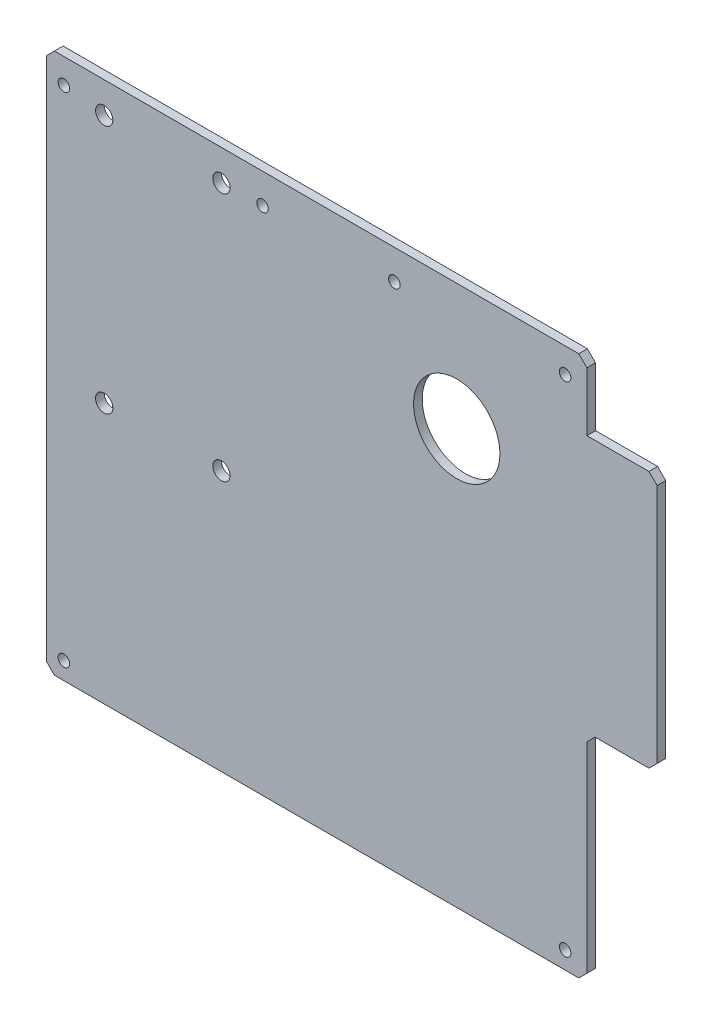
ISO-10303-21;
HEADER;
FILE_DESCRIPTION(('STEP AP214'),'2;1');
FILE_NAME('part.step','',(''),(''),'','','');
FILE_SCHEMA(('AUTOMOTIVE_DESIGN { 1 0 10303 214 1 1 1 1 }'));
ENDSEC;
DATA;
#1=APPLICATION_CONTEXT('core data for automotive mechanical design processes');
#2=APPLICATION_PROTOCOL_DEFINITION('international standard','automotive_design',2000,#1);
#3=PRODUCT_CONTEXT('',#1,'mechanical');
#4=PRODUCT('Part','Part','',(#3));
#5=PRODUCT_RELATED_PRODUCT_CATEGORY('part','',(#4));
#6=PRODUCT_DEFINITION_FORMATION('','',#4);
#7=PRODUCT_DEFINITION_CONTEXT('part definition',#1,'design');
#8=PRODUCT_DEFINITION('design','',#6,#7);
#9=PRODUCT_DEFINITION_SHAPE('','',#8);
#10=(LENGTH_UNIT() NAMED_UNIT(*) SI_UNIT(.MILLI.,.METRE.));
#11=(NAMED_UNIT(*) PLANE_ANGLE_UNIT() SI_UNIT($,.RADIAN.));
#12=(NAMED_UNIT(*) SI_UNIT($,.STERADIAN.) SOLID_ANGLE_UNIT());
#13=UNCERTAINTY_MEASURE_WITH_UNIT(LENGTH_MEASURE(1.E-05),#10,'distance_accuracy_value','');
#14=(GEOMETRIC_REPRESENTATION_CONTEXT(3) GLOBAL_UNCERTAINTY_ASSIGNED_CONTEXT((#13)) GLOBAL_UNIT_ASSIGNED_CONTEXT((#10,
#11,#12)) REPRESENTATION_CONTEXT('',''));
#15=CARTESIAN_POINT('',(0.,0.,0.));
#16=DIRECTION('',(0.,0.,1.));
#17=DIRECTION('',(1.,0.,0.));
#18=AXIS2_PLACEMENT_3D('',#15,#16,#17);
#19=CARTESIAN_POINT('',(0.,0.,1.5));
#20=DIRECTION('',(0.,0.,1.));
#21=DIRECTION('',(1.,0.,0.));
#22=AXIS2_PLACEMENT_3D('',#19,#20,#21);
#23=PLANE('',#22);
#24=CARTESIAN_POINT('',(0.,-86.5552223209638,1.5));
#25=DIRECTION('',(0.,0.,1.));
#26=DIRECTION('',(1.,0.,0.));
#27=AXIS2_PLACEMENT_3D('',#24,#25,#26);
#28=CIRCLE('',#27,0.999999999999841);
#29=CARTESIAN_POINT('',(0.999999999999841,-86.5552223209638,1.5));
#30=VERTEX_POINT('',#29);
#31=EDGE_CURVE('E408',#30,#30,#28,.T.);
#32=ORIENTED_EDGE('',*,*,#31,.F.);
#33=EDGE_LOOP('',(#32));
#34=FACE_BOUND('',#33,.T.);
#35=CARTESIAN_POINT('',(7.00290071787513,-44.3172471332476,1.5));
#36=DIRECTION('',(0.,0.,1.));
#37=DIRECTION('',(1.,0.,0.));
#38=AXIS2_PLACEMENT_3D('',#35,#36,#37);
#39=CIRCLE('',#38,1.50000000000008);
#40=CARTESIAN_POINT('',(8.5029007178752,-44.3172471332476,1.5));
#41=VERTEX_POINT('',#40);
#42=EDGE_CURVE('E424',#41,#41,#39,.T.);
#43=ORIENTED_EDGE('',*,*,#42,.F.);
#44=EDGE_LOOP('',(#43));
#45=FACE_BOUND('',#44,.T.);
#46=CARTESIAN_POINT('',(87.0793798299068,0.00310699714733964,1.5));
#47=DIRECTION('',(0.,0.,1.));
#48=DIRECTION('',(1.,0.,0.));
#49=AXIS2_PLACEMENT_3D('',#46,#47,#48);
#50=CIRCLE('',#49,0.999999999999838);
#51=CARTESIAN_POINT('',(88.0793798299066,0.00310699714733964,1.5));
#52=VERTEX_POINT('',#51);
#53=EDGE_CURVE('E440',#52,#52,#50,.T.);
#54=ORIENTED_EDGE('',*,*,#53,.F.);
#55=EDGE_LOOP('',(#54));
#56=FACE_BOUND('',#55,.T.);
#57=CARTESIAN_POINT('',(34.5090412402937,-0.868109842539377,1.5));
#58=DIRECTION('',(0.,0.,1.));
#59=DIRECTION('',(1.,0.,0.));
#60=AXIS2_PLACEMENT_3D('',#57,#58,#59);
#61=CIRCLE('',#60,0.999999999999998);
#62=CARTESIAN_POINT('',(35.5090412402937,-0.868109842539377,1.5));
#63=VERTEX_POINT('',#62);
#64=EDGE_CURVE('E456',#63,#63,#61,.T.);
#65=ORIENTED_EDGE('',*,*,#64,.F.);
#66=EDGE_LOOP('',(#65));
#67=FACE_BOUND('',#66,.T.);
#68=CARTESIAN_POINT('',(7.00290071787513,-1.01847825858581,1.5));
#69=DIRECTION('',(0.,0.,1.));
#70=DIRECTION('',(1.,0.,0.));
#71=AXIS2_PLACEMENT_3D('',#68,#69,#70);
#72=CIRCLE('',#71,1.50000000000008);
#73=CARTESIAN_POINT('',(8.5029007178752,-1.01847825858581,1.5));
#74=VERTEX_POINT('',#73);
#75=EDGE_CURVE('E472',#74,#74,#72,.T.);
#76=ORIENTED_EDGE('',*,*,#75,.F.);
#77=EDGE_LOOP('',(#76));
#78=FACE_BOUND('',#77,.T.);
#79=DIRECTION('',(-0.707106781186546,0.707106781186549,0.));
#80=VECTOR('',#79,1.);
#81=CARTESIAN_POINT('',(90.867322078492,2.92282946996818,1.5));
#82=LINE('',#81,#80);
#83=CARTESIAN_POINT('',(90.867322078492,2.92282946996818,1.5));
#84=VERTEX_POINT('',#83);
#85=CARTESIAN_POINT('',(89.4531085161189,4.33704303234128,1.5));
#86=VERTEX_POINT('',#85);
#87=EDGE_CURVE('E227',#84,#86,#82,.T.);
#88=ORIENTED_EDGE('',*,*,#87,.T.);
#89=DIRECTION('',(-1.,0.,0.));
#90=VECTOR('',#89,1.);
#91=CARTESIAN_POINT('',(89.4531085161189,4.33704303234128,1.5));
#92=LINE('',#91,#90);
#93=CARTESIAN_POINT('',(-1.64322979611291,4.33704303234127,1.5));
#94=VERTEX_POINT('',#93);
#95=EDGE_CURVE('E121',#86,#94,#92,.T.);
#96=ORIENTED_EDGE('',*,*,#95,.T.);
#97=DIRECTION('',(-0.707106781186546,-0.707106781186549,0.));
#98=VECTOR('',#97,1.);
#99=CARTESIAN_POINT('',(-1.64322979611291,4.33704303234127,1.5));
#100=LINE('',#99,#98);
#101=CARTESIAN_POINT('',(-3.057443358486,2.92282946996818,1.5));
#102=VERTEX_POINT('',#101);
#103=EDGE_CURVE('E276',#94,#102,#100,.T.);
#104=ORIENTED_EDGE('',*,*,#103,.T.);
#105=DIRECTION('',(0.,-1.,0.));
#106=VECTOR('',#105,1.);
#107=CARTESIAN_POINT('',(-3.057443358486,2.92282946996818,1.5));
#108=LINE('',#107,#106);
#109=CARTESIAN_POINT('',(-3.05744335848598,-88.1735088422632,1.5));
#110=VERTEX_POINT('',#109);
#111=EDGE_CURVE('E296',#102,#110,#108,.T.);
#112=ORIENTED_EDGE('',*,*,#111,.T.);
#113=DIRECTION('',(0.707106781186546,-0.707106781186549,0.));
#114=VECTOR('',#113,1.);
#115=CARTESIAN_POINT('',(-3.05744335848598,-88.1735088422632,1.5));
#116=LINE('',#115,#114);
#117=CARTESIAN_POINT('',(-1.64322979611289,-89.5877224046363,1.5));
#118=VERTEX_POINT('',#117);
#119=EDGE_CURVE('E292',#110,#118,#116,.T.);
#120=ORIENTED_EDGE('',*,*,#119,.T.);
#121=DIRECTION('',(1.,0.,0.));
#122=VECTOR('',#121,1.);
#123=CARTESIAN_POINT('',(-1.64322979611289,-89.5877224046363,1.5));
#124=LINE('',#123,#122);
#125=CARTESIAN_POINT('',(89.4531085161188,-89.5877224046363,1.5));
#126=VERTEX_POINT('',#125);
#127=EDGE_CURVE('E295',#118,#126,#124,.T.);
#128=ORIENTED_EDGE('',*,*,#127,.T.);
#129=DIRECTION('',(0.707106781186547,0.707106781186547,0.));
#130=VECTOR('',#129,1.);
#131=CARTESIAN_POINT('',(89.4531085161188,-89.5877224046363,1.5));
#132=LINE('',#131,#130);
#133=CARTESIAN_POINT('',(90.8673220784919,-88.1735088422632,1.5));
#134=VERTEX_POINT('',#133);
#135=EDGE_CURVE('E300',#126,#134,#132,.T.);
#136=ORIENTED_EDGE('',*,*,#135,.T.);
#137=DIRECTION('',(0.,1.,0.));
#138=VECTOR('',#137,1.);
#139=CARTESIAN_POINT('',(90.8673220784919,-88.1735088422632,1.5));
#140=LINE('',#139,#138);
#141=CARTESIAN_POINT('',(90.8673220784919,-53.3416574959021,1.5));
#142=VERTEX_POINT('',#141);
#143=EDGE_CURVE('E307',#134,#142,#140,.T.);
#144=ORIENTED_EDGE('',*,*,#143,.T.);
#145=DIRECTION('',(0.707106781186549,0.707106781186546,0.));
#146=VECTOR('',#145,1.);
#147=CARTESIAN_POINT('',(90.8673220784919,-53.3416574959021,1.5));
#148=LINE('',#147,#146);
#149=CARTESIAN_POINT('',(92.281535640865,-51.927443933529,1.5));
#150=VERTEX_POINT('',#149);
#151=EDGE_CURVE('E310',#142,#150,#148,.T.);
#152=ORIENTED_EDGE('',*,*,#151,.T.);
#153=DIRECTION('',(1.,0.,0.));
#154=VECTOR('',#153,1.);
#155=CARTESIAN_POINT('',(92.281535640865,-51.927443933529,1.5));
#156=LINE('',#155,#154);
#157=CARTESIAN_POINT('',(101.643338185774,-51.927443933529,1.5));
#158=VERTEX_POINT('',#157);
#159=EDGE_CURVE('E313',#150,#158,#156,.T.);
#160=ORIENTED_EDGE('',*,*,#159,.T.);
#161=DIRECTION('',(0.707106781186547,0.707106781186547,0.));
#162=VECTOR('',#161,1.);
#163=CARTESIAN_POINT('',(101.643338185774,-51.927443933529,1.5));
#164=LINE('',#163,#162);
#165=CARTESIAN_POINT('',(103.057551748147,-50.5132303711559,1.5));
#166=VERTEX_POINT('',#165);
#167=EDGE_CURVE('E316',#158,#166,#164,.T.);
#168=ORIENTED_EDGE('',*,*,#167,.T.);
#169=DIRECTION('',(0.,1.,0.));
#170=VECTOR('',#169,1.);
#171=CARTESIAN_POINT('',(103.057551748147,-50.5132303711559,1.5));
#172=LINE('',#171,#170);
#173=CARTESIAN_POINT('',(103.057551748147,-8.69292339895869,1.5));
#174=VERTEX_POINT('',#173);
#175=EDGE_CURVE('E161',#166,#174,#172,.T.);
#176=ORIENTED_EDGE('',*,*,#175,.T.);
#177=DIRECTION('',(-0.707106781186554,0.707106781186541,0.));
#178=VECTOR('',#177,1.);
#179=CARTESIAN_POINT('',(103.057551748147,-8.69292339895869,1.5));
#180=LINE('',#179,#178);
#181=CARTESIAN_POINT('',(101.643338185774,-7.27870983658562,1.5));
#182=VERTEX_POINT('',#181);
#183=EDGE_CURVE('E155',#174,#182,#180,.T.);
#184=ORIENTED_EDGE('',*,*,#183,.T.);
#185=DIRECTION('',(-1.,0.,0.));
#186=VECTOR('',#185,1.);
#187=CARTESIAN_POINT('',(101.643338185774,-7.27870983658562,1.5));
#188=LINE('',#187,#186);
#189=CARTESIAN_POINT('',(90.8673220784919,-7.27870983658563,1.5));
#190=VERTEX_POINT('',#189);
#191=EDGE_CURVE('E159',#182,#190,#188,.T.);
#192=ORIENTED_EDGE('',*,*,#191,.T.);
#193=DIRECTION('',(0.,1.,0.));
#194=VECTOR('',#193,1.);
#195=CARTESIAN_POINT('',(90.8673220784919,-7.27870983658563,1.5));
#196=LINE('',#195,#194);
#197=EDGE_CURVE('E57',#190,#84,#196,.T.);
#198=ORIENTED_EDGE('',*,*,#197,.T.);
#199=EDGE_LOOP('',(#88,#96,#104,#112,#120,#128,#136,#144,#152,#160,#168,#176,#184,#192,#198));
#200=FACE_BOUND('',#199,.T.);
#201=CARTESIAN_POINT('',(0.,0.,1.5));
#202=DIRECTION('',(0.,0.,1.));
#203=DIRECTION('',(1.,0.,0.));
#204=AXIS2_PLACEMENT_3D('',#201,#202,#203);
#205=CIRCLE('',#204,0.999999999999839);
#206=CARTESIAN_POINT('',(0.999999999999839,0.,1.5));
#207=VERTEX_POINT('',#206);
#208=EDGE_CURVE('E188',#207,#207,#205,.T.);
#209=ORIENTED_EDGE('',*,*,#208,.F.);
#210=EDGE_LOOP('',(#209));
#211=FACE_BOUND('',#210,.T.);
#212=CARTESIAN_POINT('',(27.3718188735983,-1.01847825858581,1.5));
#213=DIRECTION('',(0.,0.,1.));
#214=DIRECTION('',(1.,0.,0.));
#215=AXIS2_PLACEMENT_3D('',#212,#213,#214);
#216=CIRCLE('',#215,1.50000000000008);
#217=CARTESIAN_POINT('',(28.8718188735984,-1.01847825858581,1.5));
#218=VERTEX_POINT('',#217);
#219=EDGE_CURVE('E464',#218,#218,#216,.T.);
#220=ORIENTED_EDGE('',*,*,#219,.F.);
#221=EDGE_LOOP('',(#220));
#222=FACE_BOUND('',#221,.T.);
#223=CARTESIAN_POINT('',(57.4135256428072,-0.868109842539377,1.5));
#224=DIRECTION('',(0.,0.,1.));
#225=DIRECTION('',(1.,0.,0.));
#226=AXIS2_PLACEMENT_3D('',#223,#224,#225);
#227=CIRCLE('',#226,0.999999999999998);
#228=CARTESIAN_POINT('',(58.4135256428072,-0.868109842539377,1.5));
#229=VERTEX_POINT('',#228);
#230=EDGE_CURVE('E448',#229,#229,#227,.T.);
#231=ORIENTED_EDGE('',*,*,#230,.F.);
#232=EDGE_LOOP('',(#231));
#233=FACE_BOUND('',#232,.T.);
#234=CARTESIAN_POINT('',(68.2506951721249,-17.5588520296848,1.5));
#235=DIRECTION('',(0.,0.,1.));
#236=DIRECTION('',(1.,0.,0.));
#237=AXIS2_PLACEMENT_3D('',#234,#235,#236);
#238=CIRCLE('',#237,7.50249488085252);
#239=CARTESIAN_POINT('',(75.7531900529774,-17.5588520296848,1.5));
#240=VERTEX_POINT('',#239);
#241=EDGE_CURVE('E432',#240,#240,#238,.T.);
#242=ORIENTED_EDGE('',*,*,#241,.F.);
#243=EDGE_LOOP('',(#242));
#244=FACE_BOUND('',#243,.T.);
#245=CARTESIAN_POINT('',(27.3718188735983,-44.3172471332476,1.5));
#246=DIRECTION('',(0.,0.,1.));
#247=DIRECTION('',(1.,0.,0.));
#248=AXIS2_PLACEMENT_3D('',#245,#246,#247);
#249=CIRCLE('',#248,1.50000000000008);
#250=CARTESIAN_POINT('',(28.8718188735984,-44.3172471332476,1.5));
#251=VERTEX_POINT('',#250);
#252=EDGE_CURVE('E416',#251,#251,#249,.T.);
#253=ORIENTED_EDGE('',*,*,#252,.F.);
#254=EDGE_LOOP('',(#253));
#255=FACE_BOUND('',#254,.T.);
#256=CARTESIAN_POINT('',(87.0793798299068,-86.5552223209638,1.5));
#257=DIRECTION('',(0.,0.,1.));
#258=DIRECTION('',(1.,0.,0.));
#259=AXIS2_PLACEMENT_3D('',#256,#257,#258);
#260=CIRCLE('',#259,0.999999999999836);
#261=CARTESIAN_POINT('',(88.0793798299066,-86.5552223209638,1.5));
#262=VERTEX_POINT('',#261);
#263=EDGE_CURVE('E397',#262,#262,#260,.T.);
#264=ORIENTED_EDGE('',*,*,#263,.F.);
#265=EDGE_LOOP('',(#264));
#266=FACE_BOUND('',#265,.T.);
#267=ADVANCED_FACE('F39',(#34,#45,#56,#67,#78,#200,#211,#222,#233,#244,#255,#266),#23,.T.);
#268=CARTESIAN_POINT('',(0.,0.,0.));
#269=DIRECTION('',(0.,0.,1.));
#270=DIRECTION('',(1.,0.,0.));
#271=AXIS2_PLACEMENT_3D('',#268,#269,#270);
#272=PLANE('',#271);
#273=DIRECTION('',(-0.707106781186546,0.707106781186549,0.));
#274=VECTOR('',#273,1.);
#275=CARTESIAN_POINT('',(90.867322078492,2.92282946996818,0.));
#276=LINE('',#275,#274);
#277=CARTESIAN_POINT('',(90.867322078492,2.92282946996818,0.));
#278=VERTEX_POINT('',#277);
#279=CARTESIAN_POINT('',(89.4531085161189,4.33704303234128,0.));
#280=VERTEX_POINT('',#279);
#281=EDGE_CURVE('E183',#278,#280,#276,.T.);
#282=ORIENTED_EDGE('',*,*,#281,.F.);
#283=DIRECTION('',(0.,1.,0.));
#284=VECTOR('',#283,1.);
#285=CARTESIAN_POINT('',(90.8673220784919,-7.27870983658563,0.));
#286=LINE('',#285,#284);
#287=CARTESIAN_POINT('',(90.8673220784919,-7.27870983658563,0.));
#288=VERTEX_POINT('',#287);
#289=EDGE_CURVE('E113',#288,#278,#286,.T.);
#290=ORIENTED_EDGE('',*,*,#289,.F.);
#291=DIRECTION('',(-1.,0.,0.));
#292=VECTOR('',#291,1.);
#293=CARTESIAN_POINT('',(101.643338185774,-7.27870983658562,0.));
#294=LINE('',#293,#292);
#295=CARTESIAN_POINT('',(101.643338185774,-7.27870983658562,0.));
#296=VERTEX_POINT('',#295);
#297=EDGE_CURVE('E107',#296,#288,#294,.T.);
#298=ORIENTED_EDGE('',*,*,#297,.F.);
#299=DIRECTION('',(-0.707106781186554,0.707106781186541,0.));
#300=VECTOR('',#299,1.);
#301=CARTESIAN_POINT('',(103.057551748147,-8.69292339895869,0.));
#302=LINE('',#301,#300);
#303=CARTESIAN_POINT('',(103.057551748147,-8.69292339895869,0.));
#304=VERTEX_POINT('',#303);
#305=EDGE_CURVE('E170',#304,#296,#302,.T.);
#306=ORIENTED_EDGE('',*,*,#305,.F.);
#307=DIRECTION('',(0.,1.,0.));
#308=VECTOR('',#307,1.);
#309=CARTESIAN_POINT('',(103.057551748147,-50.5132303711559,0.));
#310=LINE('',#309,#308);
#311=CARTESIAN_POINT('',(103.057551748147,-50.5132303711559,0.));
#312=VERTEX_POINT('',#311);
#313=EDGE_CURVE('E218',#312,#304,#310,.T.);
#314=ORIENTED_EDGE('',*,*,#313,.F.);
#315=DIRECTION('',(0.707106781186547,0.707106781186547,0.));
#316=VECTOR('',#315,1.);
#317=CARTESIAN_POINT('',(101.643338185774,-51.927443933529,0.));
#318=LINE('',#317,#316);
#319=CARTESIAN_POINT('',(101.643338185774,-51.927443933529,0.));
#320=VERTEX_POINT('',#319);
#321=EDGE_CURVE('E215',#320,#312,#318,.T.);
#322=ORIENTED_EDGE('',*,*,#321,.F.);
#323=DIRECTION('',(1.,0.,0.));
#324=VECTOR('',#323,1.);
#325=CARTESIAN_POINT('',(92.281535640865,-51.927443933529,0.));
#326=LINE('',#325,#324);
#327=CARTESIAN_POINT('',(92.281535640865,-51.927443933529,0.));
#328=VERTEX_POINT('',#327);
#329=EDGE_CURVE('E212',#328,#320,#326,.T.);
#330=ORIENTED_EDGE('',*,*,#329,.F.);
#331=DIRECTION('',(0.707106781186549,0.707106781186546,0.));
#332=VECTOR('',#331,1.);
#333=CARTESIAN_POINT('',(90.8673220784919,-53.3416574959021,0.));
#334=LINE('',#333,#332);
#335=CARTESIAN_POINT('',(90.8673220784919,-53.3416574959021,0.));
#336=VERTEX_POINT('',#335);
#337=EDGE_CURVE('E209',#336,#328,#334,.T.);
#338=ORIENTED_EDGE('',*,*,#337,.F.);
#339=DIRECTION('',(0.,1.,0.));
#340=VECTOR('',#339,1.);
#341=CARTESIAN_POINT('',(90.8673220784919,-88.1735088422632,0.));
#342=LINE('',#341,#340);
#343=CARTESIAN_POINT('',(90.8673220784919,-88.1735088422632,0.));
#344=VERTEX_POINT('',#343);
#345=EDGE_CURVE('E206',#344,#336,#342,.T.);
#346=ORIENTED_EDGE('',*,*,#345,.F.);
#347=DIRECTION('',(0.707106781186547,0.707106781186547,0.));
#348=VECTOR('',#347,1.);
#349=CARTESIAN_POINT('',(89.4531085161188,-89.5877224046363,0.));
#350=LINE('',#349,#348);
#351=CARTESIAN_POINT('',(89.4531085161188,-89.5877224046363,0.));
#352=VERTEX_POINT('',#351);
#353=EDGE_CURVE('E203',#352,#344,#350,.T.);
#354=ORIENTED_EDGE('',*,*,#353,.F.);
#355=DIRECTION('',(1.,0.,0.));
#356=VECTOR('',#355,1.);
#357=CARTESIAN_POINT('',(-1.64322979611289,-89.5877224046363,0.));
#358=LINE('',#357,#356);
#359=CARTESIAN_POINT('',(-1.64322979611289,-89.5877224046363,0.));
#360=VERTEX_POINT('',#359);
#361=EDGE_CURVE('E200',#360,#352,#358,.T.);
#362=ORIENTED_EDGE('',*,*,#361,.F.);
#363=DIRECTION('',(0.707106781186546,-0.707106781186549,0.));
#364=VECTOR('',#363,1.);
#365=CARTESIAN_POINT('',(-3.05744335848598,-88.1735088422632,0.));
#366=LINE('',#365,#364);
#367=CARTESIAN_POINT('',(-3.05744335848598,-88.1735088422632,0.));
#368=VERTEX_POINT('',#367);
#369=EDGE_CURVE('E197',#368,#360,#366,.T.);
#370=ORIENTED_EDGE('',*,*,#369,.F.);
#371=DIRECTION('',(0.,-1.,0.));
#372=VECTOR('',#371,1.);
#373=CARTESIAN_POINT('',(-3.057443358486,2.92282946996818,0.));
#374=LINE('',#373,#372);
#375=CARTESIAN_POINT('',(-3.057443358486,2.92282946996818,0.));
#376=VERTEX_POINT('',#375);
#377=EDGE_CURVE('E194',#376,#368,#374,.T.);
#378=ORIENTED_EDGE('',*,*,#377,.F.);
#379=DIRECTION('',(-0.707106781186546,-0.707106781186549,0.));
#380=VECTOR('',#379,1.);
#381=CARTESIAN_POINT('',(-1.64322979611291,4.33704303234127,0.));
#382=LINE('',#381,#380);
#383=CARTESIAN_POINT('',(-1.64322979611291,4.33704303234127,0.));
#384=VERTEX_POINT('',#383);
#385=EDGE_CURVE('E191',#384,#376,#382,.T.);
#386=ORIENTED_EDGE('',*,*,#385,.F.);
#387=DIRECTION('',(-1.,0.,0.));
#388=VECTOR('',#387,1.);
#389=CARTESIAN_POINT('',(89.4531085161189,4.33704303234128,0.));
#390=LINE('',#389,#388);
#391=EDGE_CURVE('E187',#280,#384,#390,.T.);
#392=ORIENTED_EDGE('',*,*,#391,.F.);
#393=EDGE_LOOP('',(#282,#290,#298,#306,#314,#322,#330,#338,#346,#354,#362,#370,#378,#386,#392));
#394=FACE_BOUND('',#393,.T.);
#395=CARTESIAN_POINT('',(0.,0.,0.));
#396=DIRECTION('',(0.,0.,1.));
#397=DIRECTION('',(1.,0.,0.));
#398=AXIS2_PLACEMENT_3D('',#395,#396,#397);
#399=CIRCLE('',#398,0.999999999999839);
#400=CARTESIAN_POINT('',(0.999999999999839,0.,0.));
#401=VERTEX_POINT('',#400);
#402=EDGE_CURVE('E476',#401,#401,#399,.T.);
#403=ORIENTED_EDGE('',*,*,#402,.T.);
#404=EDGE_LOOP('',(#403));
#405=FACE_BOUND('',#404,.T.);
#406=CARTESIAN_POINT('',(7.00290071787513,-1.01847825858581,0.));
#407=DIRECTION('',(0.,0.,1.));
#408=DIRECTION('',(1.,0.,0.));
#409=AXIS2_PLACEMENT_3D('',#406,#407,#408);
#410=CIRCLE('',#409,1.50000000000008);
#411=CARTESIAN_POINT('',(8.5029007178752,-1.01847825858581,0.));
#412=VERTEX_POINT('',#411);
#413=EDGE_CURVE('E468',#412,#412,#410,.T.);
#414=ORIENTED_EDGE('',*,*,#413,.T.);
#415=EDGE_LOOP('',(#414));
#416=FACE_BOUND('',#415,.T.);
#417=CARTESIAN_POINT('',(27.3718188735983,-1.01847825858581,0.));
#418=DIRECTION('',(0.,0.,1.));
#419=DIRECTION('',(1.,0.,0.));
#420=AXIS2_PLACEMENT_3D('',#417,#418,#419);
#421=CIRCLE('',#420,1.50000000000008);
#422=CARTESIAN_POINT('',(28.8718188735984,-1.01847825858581,0.));
#423=VERTEX_POINT('',#422);
#424=EDGE_CURVE('E460',#423,#423,#421,.T.);
#425=ORIENTED_EDGE('',*,*,#424,.T.);
#426=EDGE_LOOP('',(#425));
#427=FACE_BOUND('',#426,.T.);
#428=CARTESIAN_POINT('',(34.5090412402937,-0.868109842539377,0.));
#429=DIRECTION('',(0.,0.,1.));
#430=DIRECTION('',(1.,0.,0.));
#431=AXIS2_PLACEMENT_3D('',#428,#429,#430);
#432=CIRCLE('',#431,0.999999999999998);
#433=CARTESIAN_POINT('',(35.5090412402937,-0.868109842539377,0.));
#434=VERTEX_POINT('',#433);
#435=EDGE_CURVE('E452',#434,#434,#432,.T.);
#436=ORIENTED_EDGE('',*,*,#435,.T.);
#437=EDGE_LOOP('',(#436));
#438=FACE_BOUND('',#437,.T.);
#439=CARTESIAN_POINT('',(57.4135256428072,-0.868109842539377,0.));
#440=DIRECTION('',(0.,0.,1.));
#441=DIRECTION('',(1.,0.,0.));
#442=AXIS2_PLACEMENT_3D('',#439,#440,#441);
#443=CIRCLE('',#442,0.999999999999998);
#444=CARTESIAN_POINT('',(58.4135256428072,-0.868109842539377,0.));
#445=VERTEX_POINT('',#444);
#446=EDGE_CURVE('E444',#445,#445,#443,.T.);
#447=ORIENTED_EDGE('',*,*,#446,.T.);
#448=EDGE_LOOP('',(#447));
#449=FACE_BOUND('',#448,.T.);
#450=CARTESIAN_POINT('',(87.0793798299068,0.00310699714733964,0.));
#451=DIRECTION('',(0.,0.,1.));
#452=DIRECTION('',(1.,0.,0.));
#453=AXIS2_PLACEMENT_3D('',#450,#451,#452);
#454=CIRCLE('',#453,0.999999999999838);
#455=CARTESIAN_POINT('',(88.0793798299066,0.00310699714733964,0.));
#456=VERTEX_POINT('',#455);
#457=EDGE_CURVE('E436',#456,#456,#454,.T.);
#458=ORIENTED_EDGE('',*,*,#457,.T.);
#459=EDGE_LOOP('',(#458));
#460=FACE_BOUND('',#459,.T.);
#461=CARTESIAN_POINT('',(68.2506951721249,-17.5588520296848,0.));
#462=DIRECTION('',(0.,0.,1.));
#463=DIRECTION('',(1.,0.,0.));
#464=AXIS2_PLACEMENT_3D('',#461,#462,#463);
#465=CIRCLE('',#464,7.50249488085252);
#466=CARTESIAN_POINT('',(75.7531900529774,-17.5588520296848,0.));
#467=VERTEX_POINT('',#466);
#468=EDGE_CURVE('E428',#467,#467,#465,.T.);
#469=ORIENTED_EDGE('',*,*,#468,.T.);
#470=EDGE_LOOP('',(#469));
#471=FACE_BOUND('',#470,.T.);
#472=CARTESIAN_POINT('',(7.00290071787513,-44.3172471332476,0.));
#473=DIRECTION('',(0.,0.,1.));
#474=DIRECTION('',(1.,0.,0.));
#475=AXIS2_PLACEMENT_3D('',#472,#473,#474);
#476=CIRCLE('',#475,1.50000000000008);
#477=CARTESIAN_POINT('',(8.5029007178752,-44.3172471332476,0.));
#478=VERTEX_POINT('',#477);
#479=EDGE_CURVE('E420',#478,#478,#476,.T.);
#480=ORIENTED_EDGE('',*,*,#479,.T.);
#481=EDGE_LOOP('',(#480));
#482=FACE_BOUND('',#481,.T.);
#483=CARTESIAN_POINT('',(27.3718188735983,-44.3172471332476,0.));
#484=DIRECTION('',(0.,0.,1.));
#485=DIRECTION('',(1.,0.,0.));
#486=AXIS2_PLACEMENT_3D('',#483,#484,#485);
#487=CIRCLE('',#486,1.50000000000008);
#488=CARTESIAN_POINT('',(28.8718188735984,-44.3172471332476,0.));
#489=VERTEX_POINT('',#488);
#490=EDGE_CURVE('E412',#489,#489,#487,.T.);
#491=ORIENTED_EDGE('',*,*,#490,.T.);
#492=EDGE_LOOP('',(#491));
#493=FACE_BOUND('',#492,.T.);
#494=CARTESIAN_POINT('',(0.,-86.5552223209638,0.));
#495=DIRECTION('',(0.,0.,1.));
#496=DIRECTION('',(1.,0.,0.));
#497=AXIS2_PLACEMENT_3D('',#494,#495,#496);
#498=CIRCLE('',#497,0.999999999999841);
#499=CARTESIAN_POINT('',(0.999999999999841,-86.5552223209638,0.));
#500=VERTEX_POINT('',#499);
#501=EDGE_CURVE('E405',#500,#500,#498,.T.);
#502=ORIENTED_EDGE('',*,*,#501,.T.);
#503=EDGE_LOOP('',(#502));
#504=FACE_BOUND('',#503,.T.);
#505=CARTESIAN_POINT('',(87.0793798299068,-86.5552223209638,0.));
#506=DIRECTION('',(0.,0.,1.));
#507=DIRECTION('',(1.,0.,0.));
#508=AXIS2_PLACEMENT_3D('',#505,#506,#507);
#509=CIRCLE('',#508,0.999999999999836);
#510=CARTESIAN_POINT('',(88.0793798299066,-86.5552223209638,0.));
#511=VERTEX_POINT('',#510);
#512=EDGE_CURVE('E400',#511,#511,#509,.T.);
#513=ORIENTED_EDGE('',*,*,#512,.T.);
#514=EDGE_LOOP('',(#513));
#515=FACE_BOUND('',#514,.T.);
#516=ADVANCED_FACE('F280',(#394,#405,#416,#427,#438,#449,#460,#471,#482,#493,#504,#515),#272,.F.);
#517=CARTESIAN_POINT('',(90.867322078492,2.92282946996818,1.5));
#518=DIRECTION('',(-0.707106781186549,-0.707106781186546,0.));
#519=DIRECTION('',(0.707106781186546,-0.707106781186549,0.));
#520=AXIS2_PLACEMENT_3D('',#517,#518,#519);
#521=PLANE('',#520);
#522=ORIENTED_EDGE('',*,*,#281,.T.);
#523=DIRECTION('',(0.,0.,-1.));
#524=VECTOR('',#523,1.);
#525=CARTESIAN_POINT('',(89.4531085161189,4.33704303234128,1.5));
#526=LINE('',#525,#524);
#527=EDGE_CURVE('E11',#86,#280,#526,.T.);
#528=ORIENTED_EDGE('',*,*,#527,.F.);
#529=ORIENTED_EDGE('',*,*,#87,.F.);
#530=DIRECTION('',(0.,0.,-1.));
#531=VECTOR('',#530,1.);
#532=CARTESIAN_POINT('',(90.867322078492,2.92282946996818,1.5));
#533=LINE('',#532,#531);
#534=EDGE_CURVE('E179',#84,#278,#533,.T.);
#535=ORIENTED_EDGE('',*,*,#534,.T.);
#536=EDGE_LOOP('',(#522,#528,#529,#535));
#537=FACE_BOUND('',#536,.T.);
#538=ADVANCED_FACE('F41',(#537),#521,.F.);
#539=CARTESIAN_POINT('',(89.4531085161189,4.33704303234128,1.5));
#540=DIRECTION('',(0.,-1.,0.));
#541=DIRECTION('',(1.,0.,0.));
#542=AXIS2_PLACEMENT_3D('',#539,#540,#541);
#543=PLANE('',#542);
#544=ORIENTED_EDGE('',*,*,#391,.T.);
#545=DIRECTION('',(0.,0.,-1.));
#546=VECTOR('',#545,1.);
#547=CARTESIAN_POINT('',(-1.64322979611291,4.33704303234127,1.5));
#548=LINE('',#547,#546);
#549=EDGE_CURVE('E49',#94,#384,#548,.T.);
#550=ORIENTED_EDGE('',*,*,#549,.F.);
#551=ORIENTED_EDGE('',*,*,#95,.F.);
#552=ORIENTED_EDGE('',*,*,#527,.T.);
#553=EDGE_LOOP('',(#544,#550,#551,#552));
#554=FACE_BOUND('',#553,.T.);
#555=ADVANCED_FACE('F685',(#554),#543,.F.);
#556=CARTESIAN_POINT('',(-1.64322979611291,4.33704303234127,1.5));
#557=DIRECTION('',(0.707106781186549,-0.707106781186546,0.));
#558=DIRECTION('',(0.707106781186546,0.707106781186549,0.));
#559=AXIS2_PLACEMENT_3D('',#556,#557,#558);
#560=PLANE('',#559);
#561=ORIENTED_EDGE('',*,*,#385,.T.);
#562=DIRECTION('',(0.,0.,-1.));
#563=VECTOR('',#562,1.);
#564=CARTESIAN_POINT('',(-3.057443358486,2.92282946996818,1.5));
#565=LINE('',#564,#563);
#566=EDGE_CURVE('E266',#102,#376,#565,.T.);
#567=ORIENTED_EDGE('',*,*,#566,.F.);
#568=ORIENTED_EDGE('',*,*,#103,.F.);
#569=ORIENTED_EDGE('',*,*,#549,.T.);
#570=EDGE_LOOP('',(#561,#567,#568,#569));
#571=FACE_BOUND('',#570,.T.);
#572=ADVANCED_FACE('F274',(#571),#560,.F.);
#573=CARTESIAN_POINT('',(-3.057443358486,2.92282946996818,1.5));
#574=DIRECTION('',(1.,0.,0.));
#575=DIRECTION('',(0.,1.,0.));
#576=AXIS2_PLACEMENT_3D('',#573,#574,#575);
#577=PLANE('',#576);
#578=ORIENTED_EDGE('',*,*,#377,.T.);
#579=DIRECTION('',(0.,0.,-1.));
#580=VECTOR('',#579,1.);
#581=CARTESIAN_POINT('',(-3.05744335848598,-88.1735088422632,1.5));
#582=LINE('',#581,#580);
#583=EDGE_CURVE('E262',#110,#368,#582,.T.);
#584=ORIENTED_EDGE('',*,*,#583,.F.);
#585=ORIENTED_EDGE('',*,*,#111,.F.);
#586=ORIENTED_EDGE('',*,*,#566,.T.);
#587=EDGE_LOOP('',(#578,#584,#585,#586));
#588=FACE_BOUND('',#587,.T.);
#589=ADVANCED_FACE('F286',(#588),#577,.F.);
#590=CARTESIAN_POINT('',(-3.05744335848598,-88.1735088422632,1.5));
#591=DIRECTION('',(0.707106781186549,0.707106781186546,0.));
#592=DIRECTION('',(-0.707106781186546,0.707106781186549,0.));
#593=AXIS2_PLACEMENT_3D('',#590,#591,#592);
#594=PLANE('',#593);
#595=ORIENTED_EDGE('',*,*,#369,.T.);
#596=DIRECTION('',(0.,0.,-1.));
#597=VECTOR('',#596,1.);
#598=CARTESIAN_POINT('',(-1.64322979611289,-89.5877224046363,1.5));
#599=LINE('',#598,#597);
#600=EDGE_CURVE('E258',#118,#360,#599,.T.);
#601=ORIENTED_EDGE('',*,*,#600,.F.);
#602=ORIENTED_EDGE('',*,*,#119,.F.);
#603=ORIENTED_EDGE('',*,*,#583,.T.);
#604=EDGE_LOOP('',(#595,#601,#602,#603));
#605=FACE_BOUND('',#604,.T.);
#606=ADVANCED_FACE('F290',(#605),#594,.F.);
#607=CARTESIAN_POINT('',(-1.64322979611289,-89.5877224046363,1.5));
#608=DIRECTION('',(0.,1.,0.));
#609=DIRECTION('',(-1.,0.,0.));
#610=AXIS2_PLACEMENT_3D('',#607,#608,#609);
#611=PLANE('',#610);
#612=ORIENTED_EDGE('',*,*,#361,.T.);
#613=DIRECTION('',(0.,0.,-1.));
#614=VECTOR('',#613,1.);
#615=CARTESIAN_POINT('',(89.4531085161188,-89.5877224046363,1.5));
#616=LINE('',#615,#614);
#617=EDGE_CURVE('E254',#126,#352,#616,.T.);
#618=ORIENTED_EDGE('',*,*,#617,.F.);
#619=ORIENTED_EDGE('',*,*,#127,.F.);
#620=ORIENTED_EDGE('',*,*,#600,.T.);
#621=EDGE_LOOP('',(#612,#618,#619,#620));
#622=FACE_BOUND('',#621,.T.);
#623=ADVANCED_FACE('F650',(#622),#611,.F.);
#624=CARTESIAN_POINT('',(89.4531085161188,-89.5877224046363,1.5));
#625=DIRECTION('',(-0.707106781186548,0.707106781186548,0.));
#626=DIRECTION('',(-0.707106781186548,-0.707106781186548,0.));
#627=AXIS2_PLACEMENT_3D('',#624,#625,#626);
#628=PLANE('',#627);
#629=ORIENTED_EDGE('',*,*,#353,.T.);
#630=DIRECTION('',(0.,0.,-1.));
#631=VECTOR('',#630,1.);
#632=CARTESIAN_POINT('',(90.8673220784919,-88.1735088422632,1.5));
#633=LINE('',#632,#631);
#634=EDGE_CURVE('E250',#134,#344,#633,.T.);
#635=ORIENTED_EDGE('',*,*,#634,.F.);
#636=ORIENTED_EDGE('',*,*,#135,.F.);
#637=ORIENTED_EDGE('',*,*,#617,.T.);
#638=EDGE_LOOP('',(#629,#635,#636,#637));
#639=FACE_BOUND('',#638,.T.);
#640=ADVANCED_FACE('F640',(#639),#628,.F.);
#641=CARTESIAN_POINT('',(90.8673220784919,-88.1735088422632,1.5));
#642=DIRECTION('',(-1.,0.,0.));
#643=DIRECTION('',(0.,0.,1.));
#644=AXIS2_PLACEMENT_3D('',#641,#642,#643);
#645=PLANE('',#644);
#646=ORIENTED_EDGE('',*,*,#345,.T.);
#647=DIRECTION('',(0.,0.,-1.));
#648=VECTOR('',#647,1.);
#649=CARTESIAN_POINT('',(90.8673220784919,-53.3416574959021,1.5));
#650=LINE('',#649,#648);
#651=EDGE_CURVE('E246',#142,#336,#650,.T.);
#652=ORIENTED_EDGE('',*,*,#651,.F.);
#653=ORIENTED_EDGE('',*,*,#143,.F.);
#654=ORIENTED_EDGE('',*,*,#634,.T.);
#655=EDGE_LOOP('',(#646,#652,#653,#654));
#656=FACE_BOUND('',#655,.T.);
#657=ADVANCED_FACE('F630',(#656),#645,.F.);
#658=CARTESIAN_POINT('',(90.8673220784919,-53.3416574959021,1.5));
#659=DIRECTION('',(-0.707106781186546,0.707106781186549,0.));
#660=DIRECTION('',(-0.707106781186549,-0.707106781186546,0.));
#661=AXIS2_PLACEMENT_3D('',#658,#659,#660);
#662=PLANE('',#661);
#663=ORIENTED_EDGE('',*,*,#337,.T.);
#664=DIRECTION('',(0.,0.,-1.));
#665=VECTOR('',#664,1.);
#666=CARTESIAN_POINT('',(92.281535640865,-51.927443933529,1.5));
#667=LINE('',#666,#665);
#668=EDGE_CURVE('E242',#150,#328,#667,.T.);
#669=ORIENTED_EDGE('',*,*,#668,.F.);
#670=ORIENTED_EDGE('',*,*,#151,.F.);
#671=ORIENTED_EDGE('',*,*,#651,.T.);
#672=EDGE_LOOP('',(#663,#669,#670,#671));
#673=FACE_BOUND('',#672,.T.);
#674=ADVANCED_FACE('F620',(#673),#662,.F.);
#675=CARTESIAN_POINT('',(92.281535640865,-51.927443933529,1.5));
#676=DIRECTION('',(0.,1.,0.));
#677=DIRECTION('',(-1.,0.,0.));
#678=AXIS2_PLACEMENT_3D('',#675,#676,#677);
#679=PLANE('',#678);
#680=ORIENTED_EDGE('',*,*,#329,.T.);
#681=DIRECTION('',(0.,0.,-1.));
#682=VECTOR('',#681,1.);
#683=CARTESIAN_POINT('',(101.643338185774,-51.927443933529,1.5));
#684=LINE('',#683,#682);
#685=EDGE_CURVE('E238',#158,#320,#684,.T.);
#686=ORIENTED_EDGE('',*,*,#685,.F.);
#687=ORIENTED_EDGE('',*,*,#159,.F.);
#688=ORIENTED_EDGE('',*,*,#668,.T.);
#689=EDGE_LOOP('',(#680,#686,#687,#688));
#690=FACE_BOUND('',#689,.T.);
#691=ADVANCED_FACE('F611',(#690),#679,.F.);
#692=CARTESIAN_POINT('',(101.643338185774,-51.927443933529,1.5));
#693=DIRECTION('',(-0.707106781186548,0.707106781186548,0.));
#694=DIRECTION('',(-0.707106781186548,-0.707106781186548,0.));
#695=AXIS2_PLACEMENT_3D('',#692,#693,#694);
#696=PLANE('',#695);
#697=ORIENTED_EDGE('',*,*,#321,.T.);
#698=DIRECTION('',(0.,0.,-1.));
#699=VECTOR('',#698,1.);
#700=CARTESIAN_POINT('',(103.057551748147,-50.5132303711559,1.5));
#701=LINE('',#700,#699);
#702=EDGE_CURVE('E234',#166,#312,#701,.T.);
#703=ORIENTED_EDGE('',*,*,#702,.F.);
#704=ORIENTED_EDGE('',*,*,#167,.F.);
#705=ORIENTED_EDGE('',*,*,#685,.T.);
#706=EDGE_LOOP('',(#697,#703,#704,#705));
#707=FACE_BOUND('',#706,.T.);
#708=ADVANCED_FACE('F324',(#707),#696,.F.);
#709=CARTESIAN_POINT('',(103.057551748147,-50.5132303711559,1.5));
#710=DIRECTION('',(-1.,0.,0.));
#711=DIRECTION('',(0.,0.,1.));
#712=AXIS2_PLACEMENT_3D('',#709,#710,#711);
#713=PLANE('',#712);
#714=ORIENTED_EDGE('',*,*,#313,.T.);
#715=DIRECTION('',(0.,0.,-1.));
#716=VECTOR('',#715,1.);
#717=CARTESIAN_POINT('',(103.057551748147,-8.69292339895869,1.5));
#718=LINE('',#717,#716);
#719=EDGE_CURVE('E172',#174,#304,#718,.T.);
#720=ORIENTED_EDGE('',*,*,#719,.F.);
#721=ORIENTED_EDGE('',*,*,#175,.F.);
#722=ORIENTED_EDGE('',*,*,#702,.T.);
#723=EDGE_LOOP('',(#714,#720,#721,#722));
#724=FACE_BOUND('',#723,.T.);
#725=ADVANCED_FACE('F328',(#724),#713,.F.);
#726=CARTESIAN_POINT('',(103.057551748147,-8.69292339895869,1.5));
#727=DIRECTION('',(-0.707106781186541,-0.707106781186553,0.));
#728=DIRECTION('',(0.707106781186554,-0.707106781186542,0.));
#729=AXIS2_PLACEMENT_3D('',#726,#727,#728);
#730=PLANE('',#729);
#731=ORIENTED_EDGE('',*,*,#305,.T.);
#732=DIRECTION('',(0.,0.,-1.));
#733=VECTOR('',#732,1.);
#734=CARTESIAN_POINT('',(101.643338185774,-7.27870983658562,1.5));
#735=LINE('',#734,#733);
#736=EDGE_CURVE('E167',#182,#296,#735,.T.);
#737=ORIENTED_EDGE('',*,*,#736,.F.);
#738=ORIENTED_EDGE('',*,*,#183,.F.);
#739=ORIENTED_EDGE('',*,*,#719,.T.);
#740=EDGE_LOOP('',(#731,#737,#738,#739));
#741=FACE_BOUND('',#740,.T.);
#742=ADVANCED_FACE('F168',(#741),#730,.F.);
#743=CARTESIAN_POINT('',(101.643338185774,-7.27870983658562,1.5));
#744=DIRECTION('',(0.,-1.,0.));
#745=DIRECTION('',(1.,0.,0.));
#746=AXIS2_PLACEMENT_3D('',#743,#744,#745);
#747=PLANE('',#746);
#748=ORIENTED_EDGE('',*,*,#297,.T.);
#749=DIRECTION('',(0.,0.,-1.));
#750=VECTOR('',#749,1.);
#751=CARTESIAN_POINT('',(90.8673220784919,-7.27870983658563,1.5));
#752=LINE('',#751,#750);
#753=EDGE_CURVE('E173',#190,#288,#752,.T.);
#754=ORIENTED_EDGE('',*,*,#753,.F.);
#755=ORIENTED_EDGE('',*,*,#191,.F.);
#756=ORIENTED_EDGE('',*,*,#736,.T.);
#757=EDGE_LOOP('',(#748,#754,#755,#756));
#758=FACE_BOUND('',#757,.T.);
#759=ADVANCED_FACE('F175',(#758),#747,.F.);
#760=CARTESIAN_POINT('',(90.8673220784919,-7.27870983658563,1.5));
#761=DIRECTION('',(-1.,0.,0.));
#762=DIRECTION('',(0.,-1.,0.));
#763=AXIS2_PLACEMENT_3D('',#760,#761,#762);
#764=PLANE('',#763);
#765=ORIENTED_EDGE('',*,*,#289,.T.);
#766=ORIENTED_EDGE('',*,*,#534,.F.);
#767=ORIENTED_EDGE('',*,*,#197,.F.);
#768=ORIENTED_EDGE('',*,*,#753,.T.);
#769=EDGE_LOOP('',(#765,#766,#767,#768));
#770=FACE_BOUND('',#769,.T.);
#771=ADVANCED_FACE('F332',(#770),#764,.F.);
#772=CARTESIAN_POINT('',(0.,0.,1.5));
#773=DIRECTION('',(0.,0.,-1.));
#774=DIRECTION('',(-1.,0.,0.));
#775=AXIS2_PLACEMENT_3D('',#772,#773,#774);
#776=CYLINDRICAL_SURFACE('',#775,0.999999999999839);
#777=ORIENTED_EDGE('',*,*,#208,.T.);
#778=EDGE_LOOP('',(#777));
#779=FACE_BOUND('',#778,.T.);
#780=ORIENTED_EDGE('',*,*,#402,.F.);
#781=EDGE_LOOP('',(#780));
#782=FACE_BOUND('',#781,.T.);
#783=ADVANCED_FACE('F334',(#779,#782),#776,.F.);
#784=CARTESIAN_POINT('',(7.00290071787513,-1.01847825858581,1.5));
#785=DIRECTION('',(0.,0.,-1.));
#786=DIRECTION('',(-1.,0.,0.));
#787=AXIS2_PLACEMENT_3D('',#784,#785,#786);
#788=CYLINDRICAL_SURFACE('',#787,1.50000000000008);
#789=ORIENTED_EDGE('',*,*,#75,.T.);
#790=EDGE_LOOP('',(#789));
#791=FACE_BOUND('',#790,.T.);
#792=ORIENTED_EDGE('',*,*,#413,.F.);
#793=EDGE_LOOP('',(#792));
#794=FACE_BOUND('',#793,.T.);
#795=ADVANCED_FACE('F340',(#791,#794),#788,.F.);
#796=CARTESIAN_POINT('',(27.3718188735983,-1.01847825858581,1.5));
#797=DIRECTION('',(0.,0.,-1.));
#798=DIRECTION('',(-1.,0.,0.));
#799=AXIS2_PLACEMENT_3D('',#796,#797,#798);
#800=CYLINDRICAL_SURFACE('',#799,1.50000000000008);
#801=ORIENTED_EDGE('',*,*,#219,.T.);
#802=EDGE_LOOP('',(#801));
#803=FACE_BOUND('',#802,.T.);
#804=ORIENTED_EDGE('',*,*,#424,.F.);
#805=EDGE_LOOP('',(#804));
#806=FACE_BOUND('',#805,.T.);
#807=ADVANCED_FACE('F356',(#803,#806),#800,.F.);
#808=CARTESIAN_POINT('',(34.5090412402937,-0.868109842539377,1.5));
#809=DIRECTION('',(0.,0.,-1.));
#810=DIRECTION('',(-1.,0.,0.));
#811=AXIS2_PLACEMENT_3D('',#808,#809,#810);
#812=CYLINDRICAL_SURFACE('',#811,0.999999999999998);
#813=ORIENTED_EDGE('',*,*,#64,.T.);
#814=EDGE_LOOP('',(#813));
#815=FACE_BOUND('',#814,.T.);
#816=ORIENTED_EDGE('',*,*,#435,.F.);
#817=EDGE_LOOP('',(#816));
#818=FACE_BOUND('',#817,.T.);
#819=ADVANCED_FACE('F360',(#815,#818),#812,.F.);
#820=CARTESIAN_POINT('',(57.4135256428072,-0.868109842539377,1.5));
#821=DIRECTION('',(0.,0.,-1.));
#822=DIRECTION('',(-1.,0.,0.));
#823=AXIS2_PLACEMENT_3D('',#820,#821,#822);
#824=CYLINDRICAL_SURFACE('',#823,0.999999999999998);
#825=ORIENTED_EDGE('',*,*,#230,.T.);
#826=EDGE_LOOP('',(#825));
#827=FACE_BOUND('',#826,.T.);
#828=ORIENTED_EDGE('',*,*,#446,.F.);
#829=EDGE_LOOP('',(#828));
#830=FACE_BOUND('',#829,.T.);
#831=ADVANCED_FACE('F364',(#827,#830),#824,.F.);
#832=CARTESIAN_POINT('',(87.0793798299068,0.00310699714733964,1.5));
#833=DIRECTION('',(0.,0.,-1.));
#834=DIRECTION('',(-1.,0.,0.));
#835=AXIS2_PLACEMENT_3D('',#832,#833,#834);
#836=CYLINDRICAL_SURFACE('',#835,0.999999999999838);
#837=ORIENTED_EDGE('',*,*,#53,.T.);
#838=EDGE_LOOP('',(#837));
#839=FACE_BOUND('',#838,.T.);
#840=ORIENTED_EDGE('',*,*,#457,.F.);
#841=EDGE_LOOP('',(#840));
#842=FACE_BOUND('',#841,.T.);
#843=ADVANCED_FACE('F368',(#839,#842),#836,.F.);
#844=CARTESIAN_POINT('',(68.2506951721249,-17.5588520296848,1.5));
#845=DIRECTION('',(0.,0.,-1.));
#846=DIRECTION('',(-1.,0.,0.));
#847=AXIS2_PLACEMENT_3D('',#844,#845,#846);
#848=CYLINDRICAL_SURFACE('',#847,7.50249488085252);
#849=ORIENTED_EDGE('',*,*,#241,.T.);
#850=EDGE_LOOP('',(#849));
#851=FACE_BOUND('',#850,.T.);
#852=ORIENTED_EDGE('',*,*,#468,.F.);
#853=EDGE_LOOP('',(#852));
#854=FACE_BOUND('',#853,.T.);
#855=ADVANCED_FACE('F372',(#851,#854),#848,.F.);
#856=CARTESIAN_POINT('',(7.00290071787513,-44.3172471332476,1.5));
#857=DIRECTION('',(0.,0.,-1.));
#858=DIRECTION('',(-1.,0.,0.));
#859=AXIS2_PLACEMENT_3D('',#856,#857,#858);
#860=CYLINDRICAL_SURFACE('',#859,1.50000000000008);
#861=ORIENTED_EDGE('',*,*,#42,.T.);
#862=EDGE_LOOP('',(#861));
#863=FACE_BOUND('',#862,.T.);
#864=ORIENTED_EDGE('',*,*,#479,.F.);
#865=EDGE_LOOP('',(#864));
#866=FACE_BOUND('',#865,.T.);
#867=ADVANCED_FACE('F376',(#863,#866),#860,.F.);
#868=CARTESIAN_POINT('',(27.3718188735983,-44.3172471332476,1.5));
#869=DIRECTION('',(0.,0.,-1.));
#870=DIRECTION('',(-1.,0.,0.));
#871=AXIS2_PLACEMENT_3D('',#868,#869,#870);
#872=CYLINDRICAL_SURFACE('',#871,1.50000000000008);
#873=ORIENTED_EDGE('',*,*,#252,.T.);
#874=EDGE_LOOP('',(#873));
#875=FACE_BOUND('',#874,.T.);
#876=ORIENTED_EDGE('',*,*,#490,.F.);
#877=EDGE_LOOP('',(#876));
#878=FACE_BOUND('',#877,.T.);
#879=ADVANCED_FACE('F380',(#875,#878),#872,.F.);
#880=CARTESIAN_POINT('',(0.,-86.5552223209638,1.5));
#881=DIRECTION('',(0.,0.,-1.));
#882=DIRECTION('',(-1.,0.,0.));
#883=AXIS2_PLACEMENT_3D('',#880,#881,#882);
#884=CYLINDRICAL_SURFACE('',#883,0.999999999999841);
#885=ORIENTED_EDGE('',*,*,#31,.T.);
#886=EDGE_LOOP('',(#885));
#887=FACE_BOUND('',#886,.T.);
#888=ORIENTED_EDGE('',*,*,#501,.F.);
#889=EDGE_LOOP('',(#888));
#890=FACE_BOUND('',#889,.T.);
#891=ADVANCED_FACE('F384',(#887,#890),#884,.F.);
#892=CARTESIAN_POINT('',(87.0793798299068,-86.5552223209638,1.5));
#893=DIRECTION('',(0.,0.,-1.));
#894=DIRECTION('',(-1.,0.,0.));
#895=AXIS2_PLACEMENT_3D('',#892,#893,#894);
#896=CYLINDRICAL_SURFACE('',#895,0.999999999999836);
#897=ORIENTED_EDGE('',*,*,#263,.T.);
#898=EDGE_LOOP('',(#897));
#899=FACE_BOUND('',#898,.T.);
#900=ORIENTED_EDGE('',*,*,#512,.F.);
#901=EDGE_LOOP('',(#900));
#902=FACE_BOUND('',#901,.T.);
#903=ADVANCED_FACE('F388',(#899,#902),#896,.F.);
#904=CLOSED_SHELL('',(#267,#516,#538,#555,#572,#589,#606,#623,#640,#657,#674,#691,#708,#725,
#742,#759,#771,#783,#795,#807,#819,#831,#843,#855,#867,#879,#891,#903));
#905=MANIFOLD_SOLID_BREP('B2',#904);
#906=ADVANCED_BREP_SHAPE_REPRESENTATION('',(#18,#905),#14);
#907=SHAPE_DEFINITION_REPRESENTATION(#9,#906);
ENDSEC;
END-ISO-10303-21;
